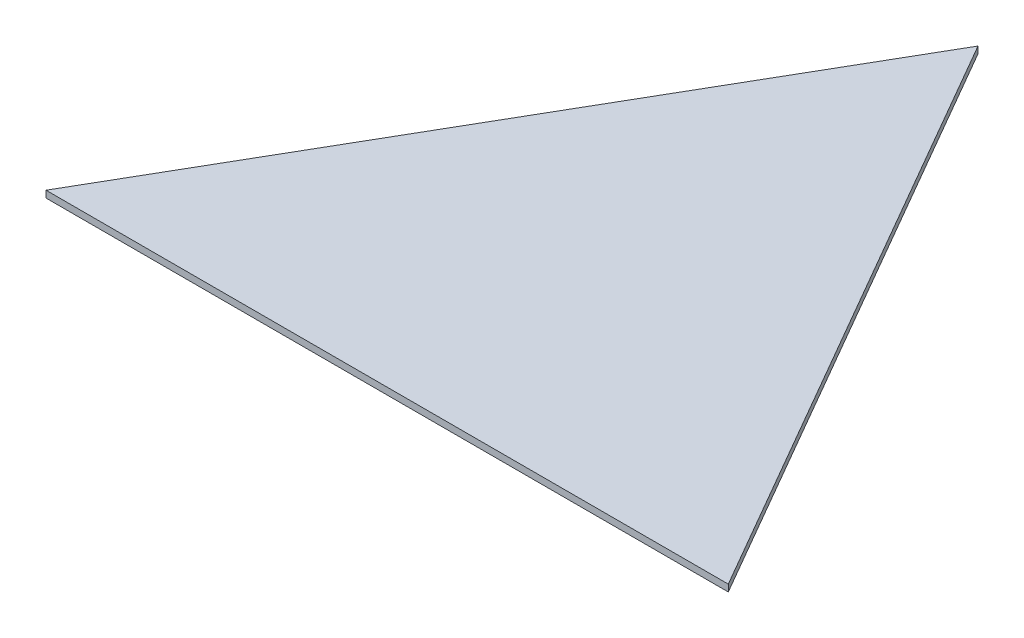
ISO-10303-21;
HEADER;
FILE_DESCRIPTION(('STEP AP214'),'2;1');
FILE_NAME('part.step','',(''),(''),'','','');
FILE_SCHEMA(('AUTOMOTIVE_DESIGN { 1 0 10303 214 1 1 1 1 }'));
ENDSEC;
DATA;
#1=APPLICATION_CONTEXT('core data for automotive mechanical design processes');
#2=APPLICATION_PROTOCOL_DEFINITION('international standard','automotive_design',2000,#1);
#3=PRODUCT_CONTEXT('',#1,'mechanical');
#4=PRODUCT('Part','Part','',(#3));
#5=PRODUCT_RELATED_PRODUCT_CATEGORY('part','',(#4));
#6=PRODUCT_DEFINITION_FORMATION('','',#4);
#7=PRODUCT_DEFINITION_CONTEXT('part definition',#1,'design');
#8=PRODUCT_DEFINITION('design','',#6,#7);
#9=PRODUCT_DEFINITION_SHAPE('','',#8);
#10=(LENGTH_UNIT() NAMED_UNIT(*) SI_UNIT(.MILLI.,.METRE.));
#11=(NAMED_UNIT(*) PLANE_ANGLE_UNIT() SI_UNIT($,.RADIAN.));
#12=(NAMED_UNIT(*) SI_UNIT($,.STERADIAN.) SOLID_ANGLE_UNIT());
#13=UNCERTAINTY_MEASURE_WITH_UNIT(LENGTH_MEASURE(1.E-05),#10,'distance_accuracy_value','');
#14=(GEOMETRIC_REPRESENTATION_CONTEXT(3) GLOBAL_UNCERTAINTY_ASSIGNED_CONTEXT((#13)) GLOBAL_UNIT_ASSIGNED_CONTEXT((#10,
#11,#12)) REPRESENTATION_CONTEXT('',''));
#15=CARTESIAN_POINT('',(0.,0.,0.));
#16=DIRECTION('',(0.,0.,1.));
#17=DIRECTION('',(1.,0.,0.));
#18=AXIS2_PLACEMENT_3D('',#15,#16,#17);
#19=CARTESIAN_POINT('',(-250.,5.,144.337567297406));
#20=DIRECTION('',(0.,0.,-1.));
#21=DIRECTION('',(-1.,0.,0.));
#22=AXIS2_PLACEMENT_3D('',#19,#20,#21);
#23=PLANE('',#22);
#24=DIRECTION('',(1.,0.,0.));
#25=VECTOR('',#24,1.);
#26=CARTESIAN_POINT('',(-250.,0.,144.337567297406));
#27=LINE('',#26,#25);
#28=CARTESIAN_POINT('',(-250.,0.,144.337567297406));
#29=VERTEX_POINT('',#28);
#30=CARTESIAN_POINT('',(250.,0.,144.337567297406));
#31=VERTEX_POINT('',#30);
#32=EDGE_CURVE('E81',#29,#31,#27,.T.);
#33=ORIENTED_EDGE('',*,*,#32,.T.);
#34=DIRECTION('',(0.,-1.,0.));
#35=VECTOR('',#34,1.);
#36=CARTESIAN_POINT('',(250.,5.,144.337567297406));
#37=LINE('',#36,#35);
#38=CARTESIAN_POINT('',(250.,5.,144.337567297406));
#39=VERTEX_POINT('',#38);
#40=EDGE_CURVE('E11',#39,#31,#37,.T.);
#41=ORIENTED_EDGE('',*,*,#40,.F.);
#42=DIRECTION('',(1.,0.,0.));
#43=VECTOR('',#42,1.);
#44=CARTESIAN_POINT('',(-250.,5.,144.337567297406));
#45=LINE('',#44,#43);
#46=CARTESIAN_POINT('',(-250.,5.,144.337567297406));
#47=VERTEX_POINT('',#46);
#48=EDGE_CURVE('E74',#47,#39,#45,.T.);
#49=ORIENTED_EDGE('',*,*,#48,.F.);
#50=DIRECTION('',(0.,-1.,0.));
#51=VECTOR('',#50,1.);
#52=CARTESIAN_POINT('',(-250.,5.,144.337567297406));
#53=LINE('',#52,#51);
#54=EDGE_CURVE('E82',#47,#29,#53,.T.);
#55=ORIENTED_EDGE('',*,*,#54,.T.);
#56=EDGE_LOOP('',(#33,#41,#49,#55));
#57=FACE_BOUND('',#56,.T.);
#58=ADVANCED_FACE('F34',(#57),#23,.F.);
#59=CARTESIAN_POINT('',(250.,5.,144.337567297406));
#60=DIRECTION('',(-0.866025403784439,0.,0.5));
#61=DIRECTION('',(0.5,0.,0.866025403784439));
#62=AXIS2_PLACEMENT_3D('',#59,#60,#61);
#63=PLANE('',#62);
#64=DIRECTION('',(-0.5,0.,-0.866025403784439));
#65=VECTOR('',#64,1.);
#66=CARTESIAN_POINT('',(250.,0.,144.337567297406));
#67=LINE('',#66,#65);
#68=CARTESIAN_POINT('',(0.,0.,-288.675134594813));
#69=VERTEX_POINT('',#68);
#70=EDGE_CURVE('E62',#31,#69,#67,.T.);
#71=ORIENTED_EDGE('',*,*,#70,.T.);
#72=DIRECTION('',(0.,-1.,0.));
#73=VECTOR('',#72,1.);
#74=CARTESIAN_POINT('',(0.,5.,-288.675134594813));
#75=LINE('',#74,#73);
#76=CARTESIAN_POINT('',(0.,5.,-288.675134594813));
#77=VERTEX_POINT('',#76);
#78=EDGE_CURVE('E42',#77,#69,#75,.T.);
#79=ORIENTED_EDGE('',*,*,#78,.F.);
#80=DIRECTION('',(-0.5,0.,-0.866025403784439));
#81=VECTOR('',#80,1.);
#82=CARTESIAN_POINT('',(250.,5.,144.337567297406));
#83=LINE('',#82,#81);
#84=EDGE_CURVE('E70',#39,#77,#83,.T.);
#85=ORIENTED_EDGE('',*,*,#84,.F.);
#86=ORIENTED_EDGE('',*,*,#40,.T.);
#87=EDGE_LOOP('',(#71,#79,#85,#86));
#88=FACE_BOUND('',#87,.T.);
#89=ADVANCED_FACE('F71',(#88),#63,.F.);
#90=CARTESIAN_POINT('',(0.,5.,-288.675134594813));
#91=DIRECTION('',(0.866025403784439,0.,0.5));
#92=DIRECTION('',(0.5,0.,-0.866025403784439));
#93=AXIS2_PLACEMENT_3D('',#90,#91,#92);
#94=PLANE('',#93);
#95=DIRECTION('',(-0.5,0.,0.866025403784439));
#96=VECTOR('',#95,1.);
#97=CARTESIAN_POINT('',(0.,0.,-288.675134594813));
#98=LINE('',#97,#96);
#99=EDGE_CURVE('E67',#69,#29,#98,.T.);
#100=ORIENTED_EDGE('',*,*,#99,.T.);
#101=ORIENTED_EDGE('',*,*,#54,.F.);
#102=DIRECTION('',(-0.5,0.,0.866025403784439));
#103=VECTOR('',#102,1.);
#104=CARTESIAN_POINT('',(0.,5.,-288.675134594813));
#105=LINE('',#104,#103);
#106=EDGE_CURVE('E50',#77,#47,#105,.T.);
#107=ORIENTED_EDGE('',*,*,#106,.F.);
#108=ORIENTED_EDGE('',*,*,#78,.T.);
#109=EDGE_LOOP('',(#100,#101,#107,#108));
#110=FACE_BOUND('',#109,.T.);
#111=ADVANCED_FACE('F89',(#110),#94,.F.);
#112=CARTESIAN_POINT('',(0.,5.,0.));
#113=DIRECTION('',(0.,1.,0.));
#114=DIRECTION('',(0.,0.,1.));
#115=AXIS2_PLACEMENT_3D('',#112,#113,#114);
#116=PLANE('',#115);
#117=ORIENTED_EDGE('',*,*,#48,.T.);
#118=ORIENTED_EDGE('',*,*,#84,.T.);
#119=ORIENTED_EDGE('',*,*,#106,.T.);
#120=EDGE_LOOP('',(#117,#118,#119));
#121=FACE_BOUND('',#120,.T.);
#122=ADVANCED_FACE('F77',(#121),#116,.T.);
#123=CARTESIAN_POINT('',(0.,0.,0.));
#124=DIRECTION('',(0.,1.,0.));
#125=DIRECTION('',(0.,0.,1.));
#126=AXIS2_PLACEMENT_3D('',#123,#124,#125);
#127=PLANE('',#126);
#128=ORIENTED_EDGE('',*,*,#32,.F.);
#129=ORIENTED_EDGE('',*,*,#99,.F.);
#130=ORIENTED_EDGE('',*,*,#70,.F.);
#131=EDGE_LOOP('',(#128,#129,#130));
#132=FACE_BOUND('',#131,.T.);
#133=ADVANCED_FACE('F90',(#132),#127,.F.);
#134=CLOSED_SHELL('',(#58,#89,#111,#122,#133));
#135=MANIFOLD_SOLID_BREP('B2',#134);
#136=ADVANCED_BREP_SHAPE_REPRESENTATION('',(#18,#135),#14);
#137=SHAPE_DEFINITION_REPRESENTATION(#9,#136);
ENDSEC;
END-ISO-10303-21;
